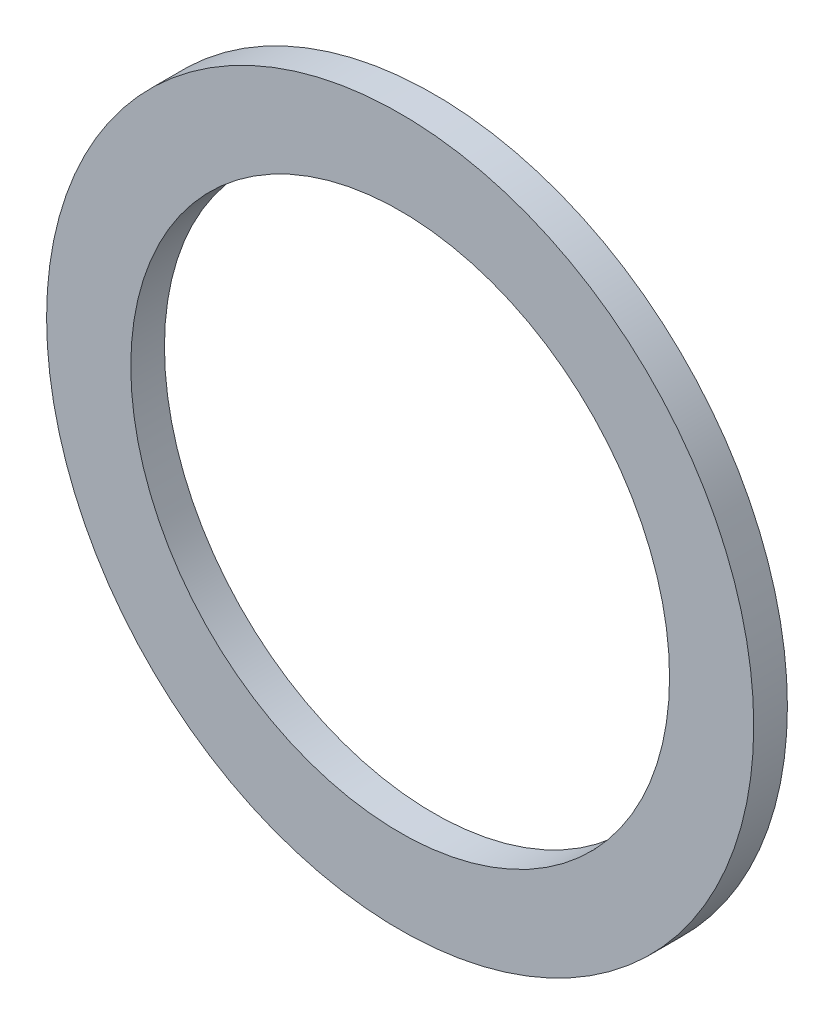
ISO-10303-21;
HEADER;
FILE_DESCRIPTION(('STEP AP214'),'2;1');
FILE_NAME('part.step','',(''),(''),'','','');
FILE_SCHEMA(('AUTOMOTIVE_DESIGN { 1 0 10303 214 1 1 1 1 }'));
ENDSEC;
DATA;
#1=APPLICATION_CONTEXT('core data for automotive mechanical design processes');
#2=APPLICATION_PROTOCOL_DEFINITION('international standard','automotive_design',2000,#1);
#3=PRODUCT_CONTEXT('',#1,'mechanical');
#4=PRODUCT('Part','Part','',(#3));
#5=PRODUCT_RELATED_PRODUCT_CATEGORY('part','',(#4));
#6=PRODUCT_DEFINITION_FORMATION('','',#4);
#7=PRODUCT_DEFINITION_CONTEXT('part definition',#1,'design');
#8=PRODUCT_DEFINITION('design','',#6,#7);
#9=PRODUCT_DEFINITION_SHAPE('','',#8);
#10=(LENGTH_UNIT() NAMED_UNIT(*) SI_UNIT(.MILLI.,.METRE.));
#11=(NAMED_UNIT(*) PLANE_ANGLE_UNIT() SI_UNIT($,.RADIAN.));
#12=(NAMED_UNIT(*) SI_UNIT($,.STERADIAN.) SOLID_ANGLE_UNIT());
#13=UNCERTAINTY_MEASURE_WITH_UNIT(LENGTH_MEASURE(1.E-05),#10,'distance_accuracy_value','');
#14=(GEOMETRIC_REPRESENTATION_CONTEXT(3) GLOBAL_UNCERTAINTY_ASSIGNED_CONTEXT((#13)) GLOBAL_UNIT_ASSIGNED_CONTEXT((#10,
#11,#12)) REPRESENTATION_CONTEXT('',''));
#15=CARTESIAN_POINT('',(0.,0.,0.));
#16=DIRECTION('',(0.,0.,1.));
#17=DIRECTION('',(1.,0.,0.));
#18=AXIS2_PLACEMENT_3D('',#15,#16,#17);
#19=CARTESIAN_POINT('',(0.,0.,0.));
#20=DIRECTION('',(0.,0.,1.));
#21=DIRECTION('',(1.,0.,0.));
#22=AXIS2_PLACEMENT_3D('',#19,#20,#21);
#23=PLANE('',#22);
#24=CARTESIAN_POINT('',(0.,0.,0.));
#25=DIRECTION('',(0.,0.,-1.));
#26=DIRECTION('',(-1.,0.,0.));
#27=AXIS2_PLACEMENT_3D('',#24,#25,#26);
#28=CIRCLE('',#27,4.);
#29=CARTESIAN_POINT('',(-4.,0.,0.));
#30=VERTEX_POINT('',#29);
#31=EDGE_CURVE('E27',#30,#30,#28,.F.);
#32=ORIENTED_EDGE('',*,*,#31,.T.);
#33=EDGE_LOOP('',(#32));
#34=FACE_BOUND('',#33,.T.);
#35=CARTESIAN_POINT('',(0.,0.,0.));
#36=DIRECTION('',(0.,0.,-1.));
#37=DIRECTION('',(-1.,0.,0.));
#38=AXIS2_PLACEMENT_3D('',#35,#36,#37);
#39=CIRCLE('',#38,5.25);
#40=CARTESIAN_POINT('',(-5.25,0.,0.));
#41=VERTEX_POINT('',#40);
#42=EDGE_CURVE('E18',#41,#41,#39,.F.);
#43=ORIENTED_EDGE('',*,*,#42,.F.);
#44=EDGE_LOOP('',(#43));
#45=FACE_BOUND('',#44,.T.);
#46=ADVANCED_FACE('F15',(#34,#45),#23,.F.);
#47=CARTESIAN_POINT('',(0.,0.,0.5));
#48=DIRECTION('',(0.,0.,-1.));
#49=DIRECTION('',(-1.,0.,0.));
#50=AXIS2_PLACEMENT_3D('',#47,#48,#49);
#51=CYLINDRICAL_SURFACE('',#50,5.25);
#52=ORIENTED_EDGE('',*,*,#42,.T.);
#53=EDGE_LOOP('',(#52));
#54=FACE_BOUND('',#53,.T.);
#55=CARTESIAN_POINT('',(0.,0.,0.5));
#56=DIRECTION('',(0.,0.,-1.));
#57=DIRECTION('',(-1.,0.,0.));
#58=AXIS2_PLACEMENT_3D('',#55,#56,#57);
#59=CIRCLE('',#58,5.25);
#60=CARTESIAN_POINT('',(-5.25,0.,0.5));
#61=VERTEX_POINT('',#60);
#62=EDGE_CURVE('E22',#61,#61,#59,.F.);
#63=ORIENTED_EDGE('',*,*,#62,.F.);
#64=EDGE_LOOP('',(#63));
#65=FACE_BOUND('',#64,.T.);
#66=ADVANCED_FACE('F35',(#54,#65),#51,.T.);
#67=CARTESIAN_POINT('',(0.,0.,0.5));
#68=DIRECTION('',(0.,0.,-1.));
#69=DIRECTION('',(-1.,0.,0.));
#70=AXIS2_PLACEMENT_3D('',#67,#68,#69);
#71=CYLINDRICAL_SURFACE('',#70,4.);
#72=CARTESIAN_POINT('',(0.,0.,0.5));
#73=DIRECTION('',(0.,0.,-1.));
#74=DIRECTION('',(-1.,0.,0.));
#75=AXIS2_PLACEMENT_3D('',#72,#73,#74);
#76=CIRCLE('',#75,4.);
#77=CARTESIAN_POINT('',(-4.,0.,0.5));
#78=VERTEX_POINT('',#77);
#79=EDGE_CURVE('E10',#78,#78,#76,.T.);
#80=ORIENTED_EDGE('',*,*,#79,.F.);
#81=EDGE_LOOP('',(#80));
#82=FACE_BOUND('',#81,.T.);
#83=ORIENTED_EDGE('',*,*,#31,.F.);
#84=EDGE_LOOP('',(#83));
#85=FACE_BOUND('',#84,.T.);
#86=ADVANCED_FACE('F43',(#82,#85),#71,.F.);
#87=CARTESIAN_POINT('',(0.,0.,0.5));
#88=DIRECTION('',(0.,0.,1.));
#89=DIRECTION('',(1.,0.,0.));
#90=AXIS2_PLACEMENT_3D('',#87,#88,#89);
#91=PLANE('',#90);
#92=ORIENTED_EDGE('',*,*,#79,.T.);
#93=EDGE_LOOP('',(#92));
#94=FACE_BOUND('',#93,.T.);
#95=ORIENTED_EDGE('',*,*,#62,.T.);
#96=EDGE_LOOP('',(#95));
#97=FACE_BOUND('',#96,.T.);
#98=ADVANCED_FACE('F44',(#94,#97),#91,.T.);
#99=CLOSED_SHELL('',(#46,#66,#86,#98));
#100=MANIFOLD_SOLID_BREP('B1',#99);
#101=ADVANCED_BREP_SHAPE_REPRESENTATION('',(#18,#100),#14);
#102=SHAPE_DEFINITION_REPRESENTATION(#9,#101);
ENDSEC;
END-ISO-10303-21;
